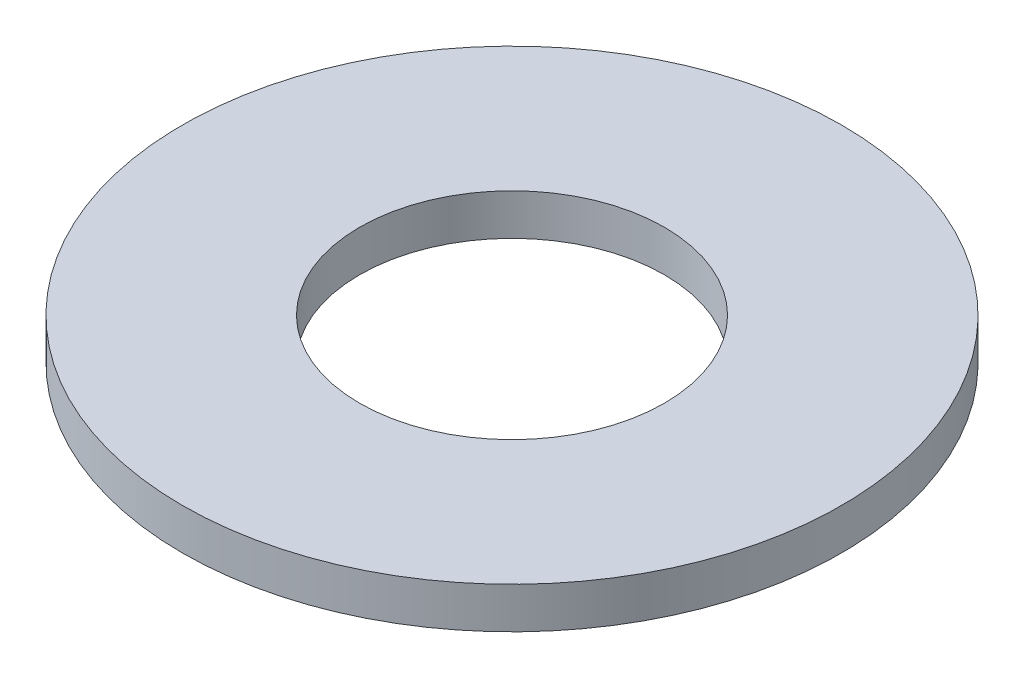
ISO-10303-21;
HEADER;
FILE_DESCRIPTION(('STEP AP214'),'2;1');
FILE_NAME('part.step','',(''),(''),'','','');
FILE_SCHEMA(('AUTOMOTIVE_DESIGN { 1 0 10303 214 1 1 1 1 }'));
ENDSEC;
DATA;
#1=APPLICATION_CONTEXT('core data for automotive mechanical design processes');
#2=APPLICATION_PROTOCOL_DEFINITION('international standard','automotive_design',2000,#1);
#3=PRODUCT_CONTEXT('',#1,'mechanical');
#4=PRODUCT('Part','Part','',(#3));
#5=PRODUCT_RELATED_PRODUCT_CATEGORY('part','',(#4));
#6=PRODUCT_DEFINITION_FORMATION('','',#4);
#7=PRODUCT_DEFINITION_CONTEXT('part definition',#1,'design');
#8=PRODUCT_DEFINITION('design','',#6,#7);
#9=PRODUCT_DEFINITION_SHAPE('','',#8);
#10=(LENGTH_UNIT() NAMED_UNIT(*) SI_UNIT(.MILLI.,.METRE.));
#11=(NAMED_UNIT(*) PLANE_ANGLE_UNIT() SI_UNIT($,.RADIAN.));
#12=(NAMED_UNIT(*) SI_UNIT($,.STERADIAN.) SOLID_ANGLE_UNIT());
#13=UNCERTAINTY_MEASURE_WITH_UNIT(LENGTH_MEASURE(1.E-05),#10,'distance_accuracy_value','');
#14=(GEOMETRIC_REPRESENTATION_CONTEXT(3) GLOBAL_UNCERTAINTY_ASSIGNED_CONTEXT((#13)) GLOBAL_UNIT_ASSIGNED_CONTEXT((#10,
#11,#12)) REPRESENTATION_CONTEXT('',''));
#15=CARTESIAN_POINT('',(0.,0.,0.));
#16=DIRECTION('',(0.,0.,1.));
#17=DIRECTION('',(1.,0.,0.));
#18=AXIS2_PLACEMENT_3D('',#15,#16,#17);
#19=CARTESIAN_POINT('',(0.,0.5,0.));
#20=DIRECTION('',(0.,1.,0.));
#21=DIRECTION('',(0.,0.,1.));
#22=AXIS2_PLACEMENT_3D('',#19,#20,#21);
#23=PLANE('',#22);
#24=CARTESIAN_POINT('',(0.,0.5,0.));
#25=DIRECTION('',(0.,1.,0.));
#26=DIRECTION('',(0.,0.,1.));
#27=AXIS2_PLACEMENT_3D('',#24,#25,#26);
#28=CIRCLE('',#27,4.);
#29=CARTESIAN_POINT('',(0.,0.5,4.));
#30=VERTEX_POINT('',#29);
#31=EDGE_CURVE('E10',#30,#30,#28,.T.);
#32=ORIENTED_EDGE('',*,*,#31,.T.);
#33=EDGE_LOOP('',(#32));
#34=FACE_BOUND('',#33,.T.);
#35=CARTESIAN_POINT('',(0.,0.5,0.));
#36=DIRECTION('',(0.,1.,0.));
#37=DIRECTION('',(0.,0.,1.));
#38=AXIS2_PLACEMENT_3D('',#35,#36,#37);
#39=CIRCLE('',#38,1.85);
#40=CARTESIAN_POINT('',(0.,0.5,1.85));
#41=VERTEX_POINT('',#40);
#42=EDGE_CURVE('E43',#41,#41,#39,.T.);
#43=ORIENTED_EDGE('',*,*,#42,.F.);
#44=EDGE_LOOP('',(#43));
#45=FACE_BOUND('',#44,.T.);
#46=ADVANCED_FACE('F32',(#34,#45),#23,.T.);
#47=CARTESIAN_POINT('',(0.,0.,0.));
#48=DIRECTION('',(0.,1.,0.));
#49=DIRECTION('',(0.,0.,1.));
#50=AXIS2_PLACEMENT_3D('',#47,#48,#49);
#51=PLANE('',#50);
#52=CARTESIAN_POINT('',(0.,0.,0.));
#53=DIRECTION('',(0.,1.,0.));
#54=DIRECTION('',(0.,0.,1.));
#55=AXIS2_PLACEMENT_3D('',#52,#53,#54);
#56=CIRCLE('',#55,4.);
#57=CARTESIAN_POINT('',(0.,0.,4.));
#58=VERTEX_POINT('',#57);
#59=EDGE_CURVE('E36',#58,#58,#56,.T.);
#60=ORIENTED_EDGE('',*,*,#59,.F.);
#61=EDGE_LOOP('',(#60));
#62=FACE_BOUND('',#61,.T.);
#63=CARTESIAN_POINT('',(0.,0.,0.));
#64=DIRECTION('',(0.,1.,0.));
#65=DIRECTION('',(0.,0.,1.));
#66=AXIS2_PLACEMENT_3D('',#63,#64,#65);
#67=CIRCLE('',#66,1.85);
#68=CARTESIAN_POINT('',(0.,0.,1.85));
#69=VERTEX_POINT('',#68);
#70=EDGE_CURVE('E45',#69,#69,#67,.T.);
#71=ORIENTED_EDGE('',*,*,#70,.T.);
#72=EDGE_LOOP('',(#71));
#73=FACE_BOUND('',#72,.T.);
#74=ADVANCED_FACE('F55',(#62,#73),#51,.F.);
#75=CARTESIAN_POINT('',(0.,0.5,0.));
#76=DIRECTION('',(0.,-1.,0.));
#77=DIRECTION('',(0.,0.,-1.));
#78=AXIS2_PLACEMENT_3D('',#75,#76,#77);
#79=CYLINDRICAL_SURFACE('',#78,4.);
#80=ORIENTED_EDGE('',*,*,#31,.F.);
#81=EDGE_LOOP('',(#80));
#82=FACE_BOUND('',#81,.T.);
#83=ORIENTED_EDGE('',*,*,#59,.T.);
#84=EDGE_LOOP('',(#83));
#85=FACE_BOUND('',#84,.T.);
#86=ADVANCED_FACE('F34',(#82,#85),#79,.T.);
#87=CARTESIAN_POINT('',(0.,0.5,0.));
#88=DIRECTION('',(0.,-1.,0.));
#89=DIRECTION('',(0.,0.,-1.));
#90=AXIS2_PLACEMENT_3D('',#87,#88,#89);
#91=CYLINDRICAL_SURFACE('',#90,1.85);
#92=ORIENTED_EDGE('',*,*,#42,.T.);
#93=EDGE_LOOP('',(#92));
#94=FACE_BOUND('',#93,.T.);
#95=ORIENTED_EDGE('',*,*,#70,.F.);
#96=EDGE_LOOP('',(#95));
#97=FACE_BOUND('',#96,.T.);
#98=ADVANCED_FACE('F51',(#94,#97),#91,.F.);
#99=CLOSED_SHELL('',(#46,#74,#86,#98));
#100=MANIFOLD_SOLID_BREP('B2',#99);
#101=ADVANCED_BREP_SHAPE_REPRESENTATION('',(#18,#100),#14);
#102=SHAPE_DEFINITION_REPRESENTATION(#9,#101);
ENDSEC;
END-ISO-10303-21;
